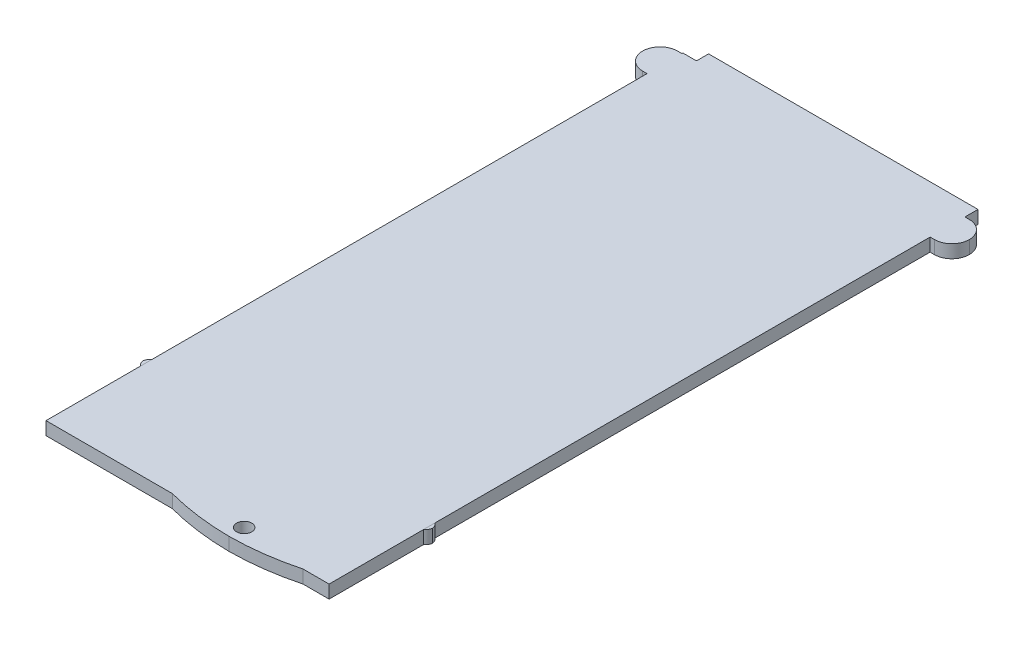
ISO-10303-21;
HEADER;
FILE_DESCRIPTION(('STEP AP214'),'2;1');
FILE_NAME('part.step','',(''),(''),'','','');
FILE_SCHEMA(('AUTOMOTIVE_DESIGN { 1 0 10303 214 1 1 1 1 }'));
ENDSEC;
DATA;
#1=APPLICATION_CONTEXT('core data for automotive mechanical design processes');
#2=APPLICATION_PROTOCOL_DEFINITION('international standard','automotive_design',2000,#1);
#3=PRODUCT_CONTEXT('',#1,'mechanical');
#4=PRODUCT('Part','Part','',(#3));
#5=PRODUCT_RELATED_PRODUCT_CATEGORY('part','',(#4));
#6=PRODUCT_DEFINITION_FORMATION('','',#4);
#7=PRODUCT_DEFINITION_CONTEXT('part definition',#1,'design');
#8=PRODUCT_DEFINITION('design','',#6,#7);
#9=PRODUCT_DEFINITION_SHAPE('','',#8);
#10=(LENGTH_UNIT() NAMED_UNIT(*) SI_UNIT(.MILLI.,.METRE.));
#11=(NAMED_UNIT(*) PLANE_ANGLE_UNIT() SI_UNIT($,.RADIAN.));
#12=(NAMED_UNIT(*) SI_UNIT($,.STERADIAN.) SOLID_ANGLE_UNIT());
#13=UNCERTAINTY_MEASURE_WITH_UNIT(LENGTH_MEASURE(1.E-05),#10,'distance_accuracy_value','');
#14=(GEOMETRIC_REPRESENTATION_CONTEXT(3) GLOBAL_UNCERTAINTY_ASSIGNED_CONTEXT((#13)) GLOBAL_UNIT_ASSIGNED_CONTEXT((#10,
#11,#12)) REPRESENTATION_CONTEXT('',''));
#15=CARTESIAN_POINT('',(0.,0.,0.));
#16=DIRECTION('',(0.,0.,1.));
#17=DIRECTION('',(1.,0.,0.));
#18=AXIS2_PLACEMENT_3D('',#15,#16,#17);
#19=CARTESIAN_POINT('',(-32.5,3.,73.));
#20=DIRECTION('',(1.,0.,0.));
#21=DIRECTION('',(0.,0.,-1.));
#22=AXIS2_PLACEMENT_3D('',#19,#20,#21);
#23=PLANE('',#22);
#24=DIRECTION('',(0.,0.,1.));
#25=VECTOR('',#24,1.);
#26=CARTESIAN_POINT('',(-32.5,0.,73.));
#27=LINE('',#26,#25);
#28=CARTESIAN_POINT('',(-32.5,0.,-62.0000000000006));
#29=VERTEX_POINT('',#28);
#30=CARTESIAN_POINT('',(-32.5,0.,51.7025621529453));
#31=VERTEX_POINT('',#30);
#32=EDGE_CURVE('E266',#29,#31,#27,.T.);
#33=ORIENTED_EDGE('',*,*,#32,.T.);
#34=DIRECTION('',(0.,1.,0.));
#35=VECTOR('',#34,1.);
#36=CARTESIAN_POINT('',(-32.5,0.,51.7025621529453));
#37=LINE('',#36,#35);
#38=CARTESIAN_POINT('',(-32.5,3.,51.7025621529453));
#39=VERTEX_POINT('',#38);
#40=EDGE_CURVE('E497',#31,#39,#37,.T.);
#41=ORIENTED_EDGE('',*,*,#40,.T.);
#42=DIRECTION('',(0.,0.,1.));
#43=VECTOR('',#42,1.);
#44=CARTESIAN_POINT('',(-32.5,3.,73.));
#45=LINE('',#44,#43);
#46=CARTESIAN_POINT('',(-32.5,3.,-62.0000000000006));
#47=VERTEX_POINT('',#46);
#48=EDGE_CURVE('E248',#47,#39,#45,.T.);
#49=ORIENTED_EDGE('',*,*,#48,.F.);
#50=DIRECTION('',(0.,-1.,0.));
#51=VECTOR('',#50,1.);
#52=CARTESIAN_POINT('',(-32.5,0.,-62.0000000000006));
#53=LINE('',#52,#51);
#54=EDGE_CURVE('E363',#47,#29,#53,.T.);
#55=ORIENTED_EDGE('',*,*,#54,.T.);
#56=EDGE_LOOP('',(#33,#41,#49,#55));
#57=FACE_BOUND('',#56,.T.);
#58=ADVANCED_FACE('F43',(#57),#23,.F.);
#59=CARTESIAN_POINT('',(32.5,3.,73.));
#60=DIRECTION('',(-1.,0.,0.));
#61=DIRECTION('',(0.,0.,1.));
#62=AXIS2_PLACEMENT_3D('',#59,#60,#61);
#63=PLANE('',#62);
#64=DIRECTION('',(0.,1.,0.));
#65=VECTOR('',#64,1.);
#66=CARTESIAN_POINT('',(32.5,0.,51.7025621529453));
#67=LINE('',#66,#65);
#68=CARTESIAN_POINT('',(32.5,0.,51.7025621529453));
#69=VERTEX_POINT('',#68);
#70=CARTESIAN_POINT('',(32.5,3.,51.7025621529453));
#71=VERTEX_POINT('',#70);
#72=EDGE_CURVE('E396',#69,#71,#67,.T.);
#73=ORIENTED_EDGE('',*,*,#72,.F.);
#74=DIRECTION('',(0.,0.,-1.));
#75=VECTOR('',#74,1.);
#76=CARTESIAN_POINT('',(32.5,0.,73.));
#77=LINE('',#76,#75);
#78=CARTESIAN_POINT('',(32.5,0.,-62.0000000000006));
#79=VERTEX_POINT('',#78);
#80=EDGE_CURVE('E260',#69,#79,#77,.T.);
#81=ORIENTED_EDGE('',*,*,#80,.T.);
#82=DIRECTION('',(0.,-1.,0.));
#83=VECTOR('',#82,1.);
#84=CARTESIAN_POINT('',(32.5,0.,-62.0000000000006));
#85=LINE('',#84,#83);
#86=CARTESIAN_POINT('',(32.5,3.,-62.0000000000006));
#87=VERTEX_POINT('',#86);
#88=EDGE_CURVE('E376',#87,#79,#85,.T.);
#89=ORIENTED_EDGE('',*,*,#88,.F.);
#90=DIRECTION('',(0.,0.,-1.));
#91=VECTOR('',#90,1.);
#92=CARTESIAN_POINT('',(32.5,3.,73.));
#93=LINE('',#92,#91);
#94=EDGE_CURVE('E252',#71,#87,#93,.T.);
#95=ORIENTED_EDGE('',*,*,#94,.F.);
#96=EDGE_LOOP('',(#73,#81,#89,#95));
#97=FACE_BOUND('',#96,.T.);
#98=ADVANCED_FACE('F394',(#97),#63,.F.);
#99=DIRECTION('',(0.,-1.,0.));
#100=VECTOR('',#99,1.);
#101=CARTESIAN_POINT('',(32.5,0.,54.3035167130892));
#102=LINE('',#101,#100);
#103=CARTESIAN_POINT('',(32.5,3.,54.3035167130892));
#104=VERTEX_POINT('',#103);
#105=CARTESIAN_POINT('',(32.5,0.,54.3035167130892));
#106=VERTEX_POINT('',#105);
#107=EDGE_CURVE('E423',#104,#106,#102,.T.);
#108=ORIENTED_EDGE('',*,*,#107,.F.);
#109=CARTESIAN_POINT('',(32.5,3.,76.));
#110=VERTEX_POINT('',#109);
#111=EDGE_CURVE('E246',#110,#104,#93,.T.);
#112=ORIENTED_EDGE('',*,*,#111,.F.);
#113=DIRECTION('',(0.,1.,0.));
#114=VECTOR('',#113,1.);
#115=CARTESIAN_POINT('',(32.5,0.,76.));
#116=LINE('',#115,#114);
#117=CARTESIAN_POINT('',(32.5,0.,76.));
#118=VERTEX_POINT('',#117);
#119=EDGE_CURVE('E330',#118,#110,#116,.T.);
#120=ORIENTED_EDGE('',*,*,#119,.F.);
#121=EDGE_CURVE('E257',#118,#106,#77,.T.);
#122=ORIENTED_EDGE('',*,*,#121,.T.);
#123=EDGE_LOOP('',(#108,#112,#120,#122));
#124=FACE_BOUND('',#123,.T.);
#125=ADVANCED_FACE('F431',(#124),#63,.F.);
#126=CARTESIAN_POINT('',(-32.5,3.,-70.2180534744469));
#127=VERTEX_POINT('',#126);
#128=CARTESIAN_POINT('',(-32.5,3.,-70.0000000000006));
#129=VERTEX_POINT('',#128);
#130=EDGE_CURVE('E250',#127,#129,#45,.T.);
#131=ORIENTED_EDGE('',*,*,#130,.F.);
#132=DIRECTION('',(0.,1.,0.));
#133=VECTOR('',#132,1.);
#134=CARTESIAN_POINT('',(-32.5,-7.,-70.2180534744469));
#135=LINE('',#134,#133);
#136=CARTESIAN_POINT('',(-32.5,0.,-70.2180534744469));
#137=VERTEX_POINT('',#136);
#138=EDGE_CURVE('E240',#137,#127,#135,.T.);
#139=ORIENTED_EDGE('',*,*,#138,.F.);
#140=CARTESIAN_POINT('',(-32.5,0.,-70.0000000000006));
#141=VERTEX_POINT('',#140);
#142=EDGE_CURVE('E264',#137,#141,#27,.T.);
#143=ORIENTED_EDGE('',*,*,#142,.T.);
#144=DIRECTION('',(0.,1.,0.));
#145=VECTOR('',#144,1.);
#146=CARTESIAN_POINT('',(-32.5,0.,-70.0000000000006));
#147=LINE('',#146,#145);
#148=EDGE_CURVE('E303',#141,#129,#147,.T.);
#149=ORIENTED_EDGE('',*,*,#148,.T.);
#150=EDGE_LOOP('',(#131,#139,#143,#149));
#151=FACE_BOUND('',#150,.T.);
#152=ADVANCED_FACE('F347',(#151),#23,.F.);
#153=DIRECTION('',(0.,1.,0.));
#154=VECTOR('',#153,1.);
#155=CARTESIAN_POINT('',(32.5,0.,-70.0000000000006));
#156=LINE('',#155,#154);
#157=CARTESIAN_POINT('',(32.5,0.,-70.0000000000006));
#158=VERTEX_POINT('',#157);
#159=CARTESIAN_POINT('',(32.5,3.,-70.0000000000006));
#160=VERTEX_POINT('',#159);
#161=EDGE_CURVE('E285',#158,#160,#156,.T.);
#162=ORIENTED_EDGE('',*,*,#161,.F.);
#163=CARTESIAN_POINT('',(32.5,0.,-73.));
#164=VERTEX_POINT('',#163);
#165=EDGE_CURVE('E261',#158,#164,#77,.T.);
#166=ORIENTED_EDGE('',*,*,#165,.T.);
#167=DIRECTION('',(0.,-1.,0.));
#168=VECTOR('',#167,1.);
#169=CARTESIAN_POINT('',(32.5,3.,-73.));
#170=LINE('',#169,#168);
#171=CARTESIAN_POINT('',(32.5,3.,-73.));
#172=VERTEX_POINT('',#171);
#173=EDGE_CURVE('E256',#172,#164,#170,.T.);
#174=ORIENTED_EDGE('',*,*,#173,.F.);
#175=EDGE_CURVE('E244',#160,#172,#93,.T.);
#176=ORIENTED_EDGE('',*,*,#175,.F.);
#177=EDGE_LOOP('',(#162,#166,#174,#176));
#178=FACE_BOUND('',#177,.T.);
#179=ADVANCED_FACE('F457',(#178),#63,.F.);
#180=CARTESIAN_POINT('',(-32.5,3.,-73.));
#181=DIRECTION('',(0.,0.,1.));
#182=DIRECTION('',(1.,0.,0.));
#183=AXIS2_PLACEMENT_3D('',#180,#181,#182);
#184=PLANE('',#183);
#185=DIRECTION('',(-1.,0.,0.));
#186=VECTOR('',#185,1.);
#187=CARTESIAN_POINT('',(-32.5,0.,-73.));
#188=LINE('',#187,#186);
#189=CARTESIAN_POINT('',(-29.3603562489109,0.,-73.));
#190=VERTEX_POINT('',#189);
#191=EDGE_CURVE('E239',#164,#190,#188,.T.);
#192=ORIENTED_EDGE('',*,*,#191,.T.);
#193=DIRECTION('',(0.,1.,0.));
#194=VECTOR('',#193,1.);
#195=CARTESIAN_POINT('',(-29.3603562489109,-7.,-73.));
#196=LINE('',#195,#194);
#197=CARTESIAN_POINT('',(-29.3603562489109,3.,-73.));
#198=VERTEX_POINT('',#197);
#199=EDGE_CURVE('E224',#190,#198,#196,.T.);
#200=ORIENTED_EDGE('',*,*,#199,.T.);
#201=DIRECTION('',(-1.,0.,0.));
#202=VECTOR('',#201,1.);
#203=CARTESIAN_POINT('',(-32.5,3.,-73.));
#204=LINE('',#203,#202);
#205=EDGE_CURVE('E236',#172,#198,#204,.T.);
#206=ORIENTED_EDGE('',*,*,#205,.F.);
#207=ORIENTED_EDGE('',*,*,#173,.T.);
#208=EDGE_LOOP('',(#192,#200,#206,#207));
#209=FACE_BOUND('',#208,.T.);
#210=ADVANCED_FACE('F234',(#209),#184,.F.);
#211=CARTESIAN_POINT('',(-32.5,3.,54.3035167130892));
#212=VERTEX_POINT('',#211);
#213=CARTESIAN_POINT('',(-32.5,3.,76.));
#214=VERTEX_POINT('',#213);
#215=EDGE_CURVE('E245',#212,#214,#45,.T.);
#216=ORIENTED_EDGE('',*,*,#215,.F.);
#217=DIRECTION('',(0.,-1.,0.));
#218=VECTOR('',#217,1.);
#219=CARTESIAN_POINT('',(-32.5,0.,54.3035167130892));
#220=LINE('',#219,#218);
#221=CARTESIAN_POINT('',(-32.5,0.,54.3035167130892));
#222=VERTEX_POINT('',#221);
#223=EDGE_CURVE('E475',#212,#222,#220,.T.);
#224=ORIENTED_EDGE('',*,*,#223,.T.);
#225=CARTESIAN_POINT('',(-32.5,0.,76.));
#226=VERTEX_POINT('',#225);
#227=EDGE_CURVE('E263',#222,#226,#27,.T.);
#228=ORIENTED_EDGE('',*,*,#227,.T.);
#229=DIRECTION('',(0.,1.,0.));
#230=VECTOR('',#229,1.);
#231=CARTESIAN_POINT('',(-32.5,0.,76.));
#232=LINE('',#231,#230);
#233=EDGE_CURVE('E478',#226,#214,#232,.T.);
#234=ORIENTED_EDGE('',*,*,#233,.T.);
#235=EDGE_LOOP('',(#216,#224,#228,#234));
#236=FACE_BOUND('',#235,.T.);
#237=ADVANCED_FACE('F452',(#236),#23,.F.);
#238=CARTESIAN_POINT('',(0.,3.,0.));
#239=DIRECTION('',(0.,-1.,0.));
#240=DIRECTION('',(0.,0.,-1.));
#241=AXIS2_PLACEMENT_3D('',#238,#239,#240);
#242=PLANE('',#241);
#243=CARTESIAN_POINT('',(11.5,3.,74.5));
#244=DIRECTION('',(0.,1.,0.));
#245=DIRECTION('',(0.,0.,1.));
#246=AXIS2_PLACEMENT_3D('',#243,#244,#245);
#247=CIRCLE('',#246,1.75);
#248=CARTESIAN_POINT('',(11.5,3.,76.25));
#249=VERTEX_POINT('',#248);
#250=EDGE_CURVE('E515',#249,#249,#247,.T.);
#251=ORIENTED_EDGE('',*,*,#250,.F.);
#252=EDGE_LOOP('',(#251));
#253=FACE_BOUND('',#252,.T.);
#254=ORIENTED_EDGE('',*,*,#205,.T.);
#255=DIRECTION('',(0.,0.,-1.));
#256=VECTOR('',#255,1.);
#257=CARTESIAN_POINT('',(-29.3603562489109,3.,-73.));
#258=LINE('',#257,#256);
#259=CARTESIAN_POINT('',(-29.3603562489109,3.,-70.2180534744469));
#260=VERTEX_POINT('',#259);
#261=EDGE_CURVE('E221',#260,#198,#258,.T.);
#262=ORIENTED_EDGE('',*,*,#261,.F.);
#263=DIRECTION('',(1.,0.,0.));
#264=VECTOR('',#263,1.);
#265=CARTESIAN_POINT('',(-29.3603562489109,3.,-70.2180534744469));
#266=LINE('',#265,#264);
#267=EDGE_CURVE('E229',#127,#260,#266,.T.);
#268=ORIENTED_EDGE('',*,*,#267,.F.);
#269=ORIENTED_EDGE('',*,*,#130,.T.);
#270=DIRECTION('',(1.,0.,0.));
#271=VECTOR('',#270,1.);
#272=CARTESIAN_POINT('',(-37.5,3.,-70.0000000000006));
#273=LINE('',#272,#271);
#274=CARTESIAN_POINT('',(-33.5,3.,-70.0000000000006));
#275=VERTEX_POINT('',#274);
#276=EDGE_CURVE('E362',#275,#129,#273,.T.);
#277=ORIENTED_EDGE('',*,*,#276,.F.);
#278=CARTESIAN_POINT('',(-33.5,3.,-66.0000000000006));
#279=DIRECTION('',(0.,-1.,0.));
#280=DIRECTION('',(0.,0.,-1.));
#281=AXIS2_PLACEMENT_3D('',#278,#279,#280);
#282=CIRCLE('',#281,4.);
#283=CARTESIAN_POINT('',(-37.5,3.,-66.0000000000006));
#284=VERTEX_POINT('',#283);
#285=EDGE_CURVE('E293',#275,#284,#282,.F.);
#286=ORIENTED_EDGE('',*,*,#285,.T.);
#287=CARTESIAN_POINT('',(-33.5,3.,-66.0000000000006));
#288=DIRECTION('',(0.,-1.,0.));
#289=DIRECTION('',(0.,0.,-1.));
#290=AXIS2_PLACEMENT_3D('',#287,#288,#289);
#291=CIRCLE('',#290,4.);
#292=CARTESIAN_POINT('',(-33.5,3.,-62.0000000000006));
#293=VERTEX_POINT('',#292);
#294=EDGE_CURVE('E295',#284,#293,#291,.F.);
#295=ORIENTED_EDGE('',*,*,#294,.T.);
#296=DIRECTION('',(1.,0.,0.));
#297=VECTOR('',#296,1.);
#298=CARTESIAN_POINT('',(-37.5,3.,-62.0000000000006));
#299=LINE('',#298,#297);
#300=EDGE_CURVE('E371',#293,#47,#299,.T.);
#301=ORIENTED_EDGE('',*,*,#300,.T.);
#302=ORIENTED_EDGE('',*,*,#48,.T.);
#303=DIRECTION('',(0.,0.,-1.));
#304=VECTOR('',#303,1.);
#305=CARTESIAN_POINT('',(-32.5,3.,0.));
#306=LINE('',#305,#304);
#307=EDGE_CURVE('E317',#212,#39,#306,.T.);
#308=ORIENTED_EDGE('',*,*,#307,.F.);
#309=ORIENTED_EDGE('',*,*,#215,.T.);
#310=DIRECTION('',(1.,0.,0.));
#311=VECTOR('',#310,1.);
#312=CARTESIAN_POINT('',(0.,3.,76.));
#313=LINE('',#312,#311);
#314=CARTESIAN_POINT('',(-3.5,3.,76.));
#315=VERTEX_POINT('',#314);
#316=EDGE_CURVE('E340',#214,#315,#313,.T.);
#317=ORIENTED_EDGE('',*,*,#316,.T.);
#318=CARTESIAN_POINT('',(11.8622914957372,3.,18.));
#319=DIRECTION('',(0.,-1.,0.));
#320=DIRECTION('',(0.,0.,-1.));
#321=AXIS2_PLACEMENT_3D('',#318,#319,#320);
#322=CIRCLE('',#321,60.);
#323=CARTESIAN_POINT('',(11.5,3.,77.9989061972976));
#324=VERTEX_POINT('',#323);
#325=EDGE_CURVE('E325',#315,#324,#322,.F.);
#326=ORIENTED_EDGE('',*,*,#325,.T.);
#327=CARTESIAN_POINT('',(11.1377085042628,3.,18.));
#328=DIRECTION('',(0.,-1.,0.));
#329=DIRECTION('',(0.,0.,-1.));
#330=AXIS2_PLACEMENT_3D('',#327,#328,#329);
#331=CIRCLE('',#330,60.);
#332=CARTESIAN_POINT('',(26.5,3.,76.));
#333=VERTEX_POINT('',#332);
#334=EDGE_CURVE('E332',#324,#333,#331,.F.);
#335=ORIENTED_EDGE('',*,*,#334,.T.);
#336=EDGE_CURVE('E509',#333,#110,#313,.T.);
#337=ORIENTED_EDGE('',*,*,#336,.T.);
#338=ORIENTED_EDGE('',*,*,#111,.T.);
#339=DIRECTION('',(0.,0.,1.));
#340=VECTOR('',#339,1.);
#341=CARTESIAN_POINT('',(32.5,3.,0.));
#342=LINE('',#341,#340);
#343=EDGE_CURVE('E304',#71,#104,#342,.T.);
#344=ORIENTED_EDGE('',*,*,#343,.F.);
#345=ORIENTED_EDGE('',*,*,#94,.T.);
#346=DIRECTION('',(-1.,0.,0.));
#347=VECTOR('',#346,1.);
#348=CARTESIAN_POINT('',(37.5,3.,-62.0000000000006));
#349=LINE('',#348,#347);
#350=CARTESIAN_POINT('',(33.5,3.,-62.0000000000006));
#351=VERTEX_POINT('',#350);
#352=EDGE_CURVE('E384',#351,#87,#349,.T.);
#353=ORIENTED_EDGE('',*,*,#352,.F.);
#354=CARTESIAN_POINT('',(33.5,3.,-66.0000000000006));
#355=DIRECTION('',(0.,-1.,0.));
#356=DIRECTION('',(0.,0.,-1.));
#357=AXIS2_PLACEMENT_3D('',#354,#355,#356);
#358=CIRCLE('',#357,4.);
#359=CARTESIAN_POINT('',(37.5,3.,-66.0000000000006));
#360=VERTEX_POINT('',#359);
#361=EDGE_CURVE('E277',#351,#360,#358,.F.);
#362=ORIENTED_EDGE('',*,*,#361,.T.);
#363=CARTESIAN_POINT('',(33.5,3.,-66.0000000000006));
#364=DIRECTION('',(0.,-1.,0.));
#365=DIRECTION('',(0.,0.,-1.));
#366=AXIS2_PLACEMENT_3D('',#363,#364,#365);
#367=CIRCLE('',#366,4.);
#368=CARTESIAN_POINT('',(33.5,3.,-70.0000000000006));
#369=VERTEX_POINT('',#368);
#370=EDGE_CURVE('E275',#360,#369,#367,.F.);
#371=ORIENTED_EDGE('',*,*,#370,.T.);
#372=DIRECTION('',(-1.,0.,0.));
#373=VECTOR('',#372,1.);
#374=CARTESIAN_POINT('',(37.5,3.,-70.0000000000006));
#375=LINE('',#374,#373);
#376=EDGE_CURVE('E386',#369,#160,#375,.T.);
#377=ORIENTED_EDGE('',*,*,#376,.T.);
#378=ORIENTED_EDGE('',*,*,#175,.T.);
#379=EDGE_LOOP('',(#254,#262,#268,#269,#277,#286,#295,#301,#302,#308,#309,#317,#326,#335,#337,
#338,#344,#345,#353,#362,#371,#377,#378));
#380=FACE_BOUND('',#379,.T.);
#381=ADVANCED_FACE('F242',(#253,#380),#242,.F.);
#382=CARTESIAN_POINT('',(0.,0.,0.));
#383=DIRECTION('',(0.,-1.,0.));
#384=DIRECTION('',(0.,0.,-1.));
#385=AXIS2_PLACEMENT_3D('',#382,#383,#384);
#386=PLANE('',#385);
#387=CARTESIAN_POINT('',(11.5,0.,74.5));
#388=DIRECTION('',(0.,-1.,0.));
#389=DIRECTION('',(0.,0.,-1.));
#390=AXIS2_PLACEMENT_3D('',#387,#388,#389);
#391=CIRCLE('',#390,1.75);
#392=CARTESIAN_POINT('',(11.5,0.,72.75));
#393=VERTEX_POINT('',#392);
#394=EDGE_CURVE('E47',#393,#393,#391,.T.);
#395=ORIENTED_EDGE('',*,*,#394,.F.);
#396=EDGE_LOOP('',(#395));
#397=FACE_BOUND('',#396,.T.);
#398=DIRECTION('',(0.,0.,1.));
#399=VECTOR('',#398,1.);
#400=CARTESIAN_POINT('',(-29.3603562489109,0.,0.));
#401=LINE('',#400,#399);
#402=CARTESIAN_POINT('',(-29.3603562489109,0.,-70.2180534744469));
#403=VERTEX_POINT('',#402);
#404=EDGE_CURVE('E11',#190,#403,#401,.T.);
#405=ORIENTED_EDGE('',*,*,#404,.F.);
#406=ORIENTED_EDGE('',*,*,#191,.F.);
#407=ORIENTED_EDGE('',*,*,#165,.F.);
#408=DIRECTION('',(-1.,0.,0.));
#409=VECTOR('',#408,1.);
#410=CARTESIAN_POINT('',(37.5,0.,-70.0000000000006));
#411=LINE('',#410,#409);
#412=CARTESIAN_POINT('',(33.5,0.,-70.0000000000006));
#413=VERTEX_POINT('',#412);
#414=EDGE_CURVE('E379',#413,#158,#411,.T.);
#415=ORIENTED_EDGE('',*,*,#414,.F.);
#416=CARTESIAN_POINT('',(33.5,0.,-66.0000000000006));
#417=DIRECTION('',(0.,-1.,0.));
#418=DIRECTION('',(0.,0.,-1.));
#419=AXIS2_PLACEMENT_3D('',#416,#417,#418);
#420=CIRCLE('',#419,4.);
#421=CARTESIAN_POINT('',(37.5,0.,-66.0000000000006));
#422=VERTEX_POINT('',#421);
#423=EDGE_CURVE('E268',#413,#422,#420,.T.);
#424=ORIENTED_EDGE('',*,*,#423,.T.);
#425=CARTESIAN_POINT('',(33.5,0.,-66.0000000000006));
#426=DIRECTION('',(0.,-1.,0.));
#427=DIRECTION('',(0.,0.,-1.));
#428=AXIS2_PLACEMENT_3D('',#425,#426,#427);
#429=CIRCLE('',#428,4.);
#430=CARTESIAN_POINT('',(33.5,0.,-62.0000000000006));
#431=VERTEX_POINT('',#430);
#432=EDGE_CURVE('E270',#422,#431,#429,.T.);
#433=ORIENTED_EDGE('',*,*,#432,.T.);
#434=DIRECTION('',(-1.,0.,0.));
#435=VECTOR('',#434,1.);
#436=CARTESIAN_POINT('',(37.5,0.,-62.0000000000006));
#437=LINE('',#436,#435);
#438=EDGE_CURVE('E381',#431,#79,#437,.T.);
#439=ORIENTED_EDGE('',*,*,#438,.T.);
#440=ORIENTED_EDGE('',*,*,#80,.F.);
#441=CARTESIAN_POINT('',(31.3,0.,53.3025621529453));
#442=DIRECTION('',(0.,-1.,0.));
#443=DIRECTION('',(0.,0.,-1.));
#444=AXIS2_PLACEMENT_3D('',#441,#442,#443);
#445=CIRCLE('',#444,2.);
#446=CARTESIAN_POINT('',(33.2774443456762,0.,53.0030394330172));
#447=VERTEX_POINT('',#446);
#448=EDGE_CURVE('E310',#69,#447,#445,.T.);
#449=ORIENTED_EDGE('',*,*,#448,.T.);
#450=CARTESIAN_POINT('',(31.3,0.,52.7035167130892));
#451=DIRECTION('',(0.,-1.,0.));
#452=DIRECTION('',(0.,0.,-1.));
#453=AXIS2_PLACEMENT_3D('',#450,#451,#452);
#454=CIRCLE('',#453,2.);
#455=EDGE_CURVE('E308',#447,#106,#454,.T.);
#456=ORIENTED_EDGE('',*,*,#455,.T.);
#457=ORIENTED_EDGE('',*,*,#121,.F.);
#458=DIRECTION('',(1.,0.,0.));
#459=VECTOR('',#458,1.);
#460=CARTESIAN_POINT('',(0.,0.,76.));
#461=LINE('',#460,#459);
#462=CARTESIAN_POINT('',(26.5,0.,76.));
#463=VERTEX_POINT('',#462);
#464=EDGE_CURVE('E435',#463,#118,#461,.T.);
#465=ORIENTED_EDGE('',*,*,#464,.F.);
#466=CARTESIAN_POINT('',(11.1377085042628,0.,18.));
#467=DIRECTION('',(0.,-1.,0.));
#468=DIRECTION('',(0.,0.,-1.));
#469=AXIS2_PLACEMENT_3D('',#466,#467,#468);
#470=CIRCLE('',#469,60.);
#471=CARTESIAN_POINT('',(11.5,0.,77.9989061972976));
#472=VERTEX_POINT('',#471);
#473=EDGE_CURVE('E66',#463,#472,#470,.T.);
#474=ORIENTED_EDGE('',*,*,#473,.T.);
#475=CARTESIAN_POINT('',(11.8622914957372,0.,18.));
#476=DIRECTION('',(0.,-1.,0.));
#477=DIRECTION('',(0.,0.,-1.));
#478=AXIS2_PLACEMENT_3D('',#475,#476,#477);
#479=CIRCLE('',#478,60.);
#480=CARTESIAN_POINT('',(-3.5,0.,76.));
#481=VERTEX_POINT('',#480);
#482=EDGE_CURVE('E334',#472,#481,#479,.T.);
#483=ORIENTED_EDGE('',*,*,#482,.T.);
#484=EDGE_CURVE('E510',#226,#481,#461,.T.);
#485=ORIENTED_EDGE('',*,*,#484,.F.);
#486=ORIENTED_EDGE('',*,*,#227,.F.);
#487=CARTESIAN_POINT('',(-31.3,0.,52.7035167130892));
#488=DIRECTION('',(0.,-1.,0.));
#489=DIRECTION('',(0.,0.,-1.));
#490=AXIS2_PLACEMENT_3D('',#487,#488,#489);
#491=CIRCLE('',#490,2.);
#492=CARTESIAN_POINT('',(-33.2774443456762,0.,53.0030394330172));
#493=VERTEX_POINT('',#492);
#494=EDGE_CURVE('E321',#222,#493,#491,.T.);
#495=ORIENTED_EDGE('',*,*,#494,.T.);
#496=CARTESIAN_POINT('',(-31.3,0.,53.3025621529453));
#497=DIRECTION('',(0.,-1.,0.));
#498=DIRECTION('',(0.,0.,-1.));
#499=AXIS2_PLACEMENT_3D('',#496,#497,#498);
#500=CIRCLE('',#499,2.);
#501=EDGE_CURVE('E323',#493,#31,#500,.T.);
#502=ORIENTED_EDGE('',*,*,#501,.T.);
#503=ORIENTED_EDGE('',*,*,#32,.F.);
#504=DIRECTION('',(1.,0.,0.));
#505=VECTOR('',#504,1.);
#506=CARTESIAN_POINT('',(-37.5,0.,-62.0000000000006));
#507=LINE('',#506,#505);
#508=CARTESIAN_POINT('',(-33.5,0.,-62.0000000000006));
#509=VERTEX_POINT('',#508);
#510=EDGE_CURVE('E357',#509,#29,#507,.T.);
#511=ORIENTED_EDGE('',*,*,#510,.F.);
#512=CARTESIAN_POINT('',(-33.5,0.,-66.0000000000006));
#513=DIRECTION('',(0.,-1.,0.));
#514=DIRECTION('',(0.,0.,-1.));
#515=AXIS2_PLACEMENT_3D('',#512,#513,#514);
#516=CIRCLE('',#515,4.);
#517=CARTESIAN_POINT('',(-37.5,0.,-66.0000000000006));
#518=VERTEX_POINT('',#517);
#519=EDGE_CURVE('E291',#509,#518,#516,.T.);
#520=ORIENTED_EDGE('',*,*,#519,.T.);
#521=CARTESIAN_POINT('',(-33.5,0.,-66.0000000000006));
#522=DIRECTION('',(0.,-1.,0.));
#523=DIRECTION('',(0.,0.,-1.));
#524=AXIS2_PLACEMENT_3D('',#521,#522,#523);
#525=CIRCLE('',#524,4.);
#526=CARTESIAN_POINT('',(-33.5,0.,-70.0000000000006));
#527=VERTEX_POINT('',#526);
#528=EDGE_CURVE('E289',#518,#527,#525,.T.);
#529=ORIENTED_EDGE('',*,*,#528,.T.);
#530=DIRECTION('',(1.,0.,0.));
#531=VECTOR('',#530,1.);
#532=CARTESIAN_POINT('',(-37.5,0.,-70.0000000000006));
#533=LINE('',#532,#531);
#534=EDGE_CURVE('E286',#527,#141,#533,.T.);
#535=ORIENTED_EDGE('',*,*,#534,.T.);
#536=ORIENTED_EDGE('',*,*,#142,.F.);
#537=DIRECTION('',(-1.,0.,0.));
#538=VECTOR('',#537,1.);
#539=CARTESIAN_POINT('',(0.,0.,-70.2180534744469));
#540=LINE('',#539,#538);
#541=EDGE_CURVE('E52',#403,#137,#540,.T.);
#542=ORIENTED_EDGE('',*,*,#541,.F.);
#543=EDGE_LOOP('',(#405,#406,#407,#415,#424,#433,#439,#440,#449,#456,#457,#465,#474,#483,#485,
#486,#495,#502,#503,#511,#520,#529,#535,#536,#542));
#544=FACE_BOUND('',#543,.T.);
#545=ADVANCED_FACE('F351',(#397,#544),#386,.T.);
#546=CARTESIAN_POINT('',(37.5,0.,-70.0000000000006));
#547=DIRECTION('',(0.,0.,1.));
#548=DIRECTION('',(1.,0.,0.));
#549=AXIS2_PLACEMENT_3D('',#546,#547,#548);
#550=PLANE('',#549);
#551=ORIENTED_EDGE('',*,*,#376,.F.);
#552=DIRECTION('',(0.,1.,0.));
#553=VECTOR('',#552,1.);
#554=CARTESIAN_POINT('',(33.5,0.,-70.0000000000006));
#555=LINE('',#554,#553);
#556=EDGE_CURVE('E279',#369,#413,#555,.F.);
#557=ORIENTED_EDGE('',*,*,#556,.T.);
#558=ORIENTED_EDGE('',*,*,#414,.T.);
#559=ORIENTED_EDGE('',*,*,#161,.T.);
#560=EDGE_LOOP('',(#551,#557,#558,#559));
#561=FACE_BOUND('',#560,.T.);
#562=ADVANCED_FACE('F525',(#561),#550,.F.);
#563=CARTESIAN_POINT('',(37.5,0.,-62.0000000000006));
#564=DIRECTION('',(0.,0.,-1.));
#565=DIRECTION('',(-1.,0.,0.));
#566=AXIS2_PLACEMENT_3D('',#563,#564,#565);
#567=PLANE('',#566);
#568=ORIENTED_EDGE('',*,*,#438,.F.);
#569=DIRECTION('',(0.,-1.,0.));
#570=VECTOR('',#569,1.);
#571=CARTESIAN_POINT('',(33.5,3.,-62.0000000000006));
#572=LINE('',#571,#570);
#573=EDGE_CURVE('E272',#431,#351,#572,.F.);
#574=ORIENTED_EDGE('',*,*,#573,.T.);
#575=ORIENTED_EDGE('',*,*,#352,.T.);
#576=ORIENTED_EDGE('',*,*,#88,.T.);
#577=EDGE_LOOP('',(#568,#574,#575,#576));
#578=FACE_BOUND('',#577,.T.);
#579=ADVANCED_FACE('F402',(#578),#567,.F.);
#580=CARTESIAN_POINT('',(33.5,0.,-66.0000000000006));
#581=DIRECTION('',(0.,-1.,0.));
#582=DIRECTION('',(0.,0.,-1.));
#583=AXIS2_PLACEMENT_3D('',#580,#581,#582);
#584=CYLINDRICAL_SURFACE('',#583,4.);
#585=ORIENTED_EDGE('',*,*,#556,.F.);
#586=ORIENTED_EDGE('',*,*,#370,.F.);
#587=DIRECTION('',(0.,1.,0.));
#588=VECTOR('',#587,1.);
#589=CARTESIAN_POINT('',(37.5,3.,-66.0000000000006));
#590=LINE('',#589,#588);
#591=EDGE_CURVE('E282',#422,#360,#590,.T.);
#592=ORIENTED_EDGE('',*,*,#591,.F.);
#593=ORIENTED_EDGE('',*,*,#423,.F.);
#594=EDGE_LOOP('',(#585,#586,#592,#593));
#595=FACE_BOUND('',#594,.T.);
#596=ADVANCED_FACE('F535',(#595),#584,.T.);
#597=CARTESIAN_POINT('',(33.5,0.,-66.0000000000006));
#598=DIRECTION('',(0.,1.,0.));
#599=DIRECTION('',(0.,0.,1.));
#600=AXIS2_PLACEMENT_3D('',#597,#598,#599);
#601=CYLINDRICAL_SURFACE('',#600,4.);
#602=ORIENTED_EDGE('',*,*,#361,.F.);
#603=ORIENTED_EDGE('',*,*,#573,.F.);
#604=ORIENTED_EDGE('',*,*,#432,.F.);
#605=ORIENTED_EDGE('',*,*,#591,.T.);
#606=EDGE_LOOP('',(#602,#603,#604,#605));
#607=FACE_BOUND('',#606,.T.);
#608=ADVANCED_FACE('F538',(#607),#601,.T.);
#609=CARTESIAN_POINT('',(-37.5,0.,-70.0000000000006));
#610=DIRECTION('',(0.,0.,-1.));
#611=DIRECTION('',(-1.,0.,0.));
#612=AXIS2_PLACEMENT_3D('',#609,#610,#611);
#613=PLANE('',#612);
#614=ORIENTED_EDGE('',*,*,#534,.F.);
#615=DIRECTION('',(0.,1.,0.));
#616=VECTOR('',#615,1.);
#617=CARTESIAN_POINT('',(-33.5,0.,-70.0000000000006));
#618=LINE('',#617,#616);
#619=EDGE_CURVE('E297',#527,#275,#618,.T.);
#620=ORIENTED_EDGE('',*,*,#619,.T.);
#621=ORIENTED_EDGE('',*,*,#276,.T.);
#622=ORIENTED_EDGE('',*,*,#148,.F.);
#623=EDGE_LOOP('',(#614,#620,#621,#622));
#624=FACE_BOUND('',#623,.T.);
#625=ADVANCED_FACE('F360',(#624),#613,.T.);
#626=CARTESIAN_POINT('',(-37.5,0.,-62.0000000000006));
#627=DIRECTION('',(0.,0.,1.));
#628=DIRECTION('',(1.,0.,0.));
#629=AXIS2_PLACEMENT_3D('',#626,#627,#628);
#630=PLANE('',#629);
#631=ORIENTED_EDGE('',*,*,#300,.F.);
#632=DIRECTION('',(0.,-1.,0.));
#633=VECTOR('',#632,1.);
#634=CARTESIAN_POINT('',(-33.5,0.,-62.0000000000006));
#635=LINE('',#634,#633);
#636=EDGE_CURVE('E281',#293,#509,#635,.T.);
#637=ORIENTED_EDGE('',*,*,#636,.T.);
#638=ORIENTED_EDGE('',*,*,#510,.T.);
#639=ORIENTED_EDGE('',*,*,#54,.F.);
#640=EDGE_LOOP('',(#631,#637,#638,#639));
#641=FACE_BOUND('',#640,.T.);
#642=ADVANCED_FACE('F537',(#641),#630,.T.);
#643=CARTESIAN_POINT('',(-33.5,0.,-66.0000000000006));
#644=DIRECTION('',(0.,1.,0.));
#645=DIRECTION('',(0.,0.,1.));
#646=AXIS2_PLACEMENT_3D('',#643,#644,#645);
#647=CYLINDRICAL_SURFACE('',#646,4.);
#648=DIRECTION('',(0.,1.,0.));
#649=VECTOR('',#648,1.);
#650=CARTESIAN_POINT('',(-37.5,0.,-66.0000000000006));
#651=LINE('',#650,#649);
#652=EDGE_CURVE('E300',#284,#518,#651,.F.);
#653=ORIENTED_EDGE('',*,*,#652,.F.);
#654=ORIENTED_EDGE('',*,*,#285,.F.);
#655=ORIENTED_EDGE('',*,*,#619,.F.);
#656=ORIENTED_EDGE('',*,*,#528,.F.);
#657=EDGE_LOOP('',(#653,#654,#655,#656));
#658=FACE_BOUND('',#657,.T.);
#659=ADVANCED_FACE('F540',(#658),#647,.T.);
#660=CARTESIAN_POINT('',(-33.5,0.,-66.0000000000006));
#661=DIRECTION('',(0.,-1.,0.));
#662=DIRECTION('',(0.,0.,-1.));
#663=AXIS2_PLACEMENT_3D('',#660,#661,#662);
#664=CYLINDRICAL_SURFACE('',#663,4.);
#665=ORIENTED_EDGE('',*,*,#294,.F.);
#666=ORIENTED_EDGE('',*,*,#652,.T.);
#667=ORIENTED_EDGE('',*,*,#519,.F.);
#668=ORIENTED_EDGE('',*,*,#636,.F.);
#669=EDGE_LOOP('',(#665,#666,#667,#668));
#670=FACE_BOUND('',#669,.T.);
#671=ADVANCED_FACE('F446',(#670),#664,.T.);
#672=CARTESIAN_POINT('',(32.5,0.,0.));
#673=DIRECTION('',(1.,0.,0.));
#674=DIRECTION('',(0.,0.,-1.));
#675=AXIS2_PLACEMENT_3D('',#672,#673,#674);
#676=PLANE('',#675);
#677=CARTESIAN_POINT('',(32.5,3.0011014155507,51.7025621529453));
#678=VERTEX_POINT('',#677);
#679=EDGE_CURVE('E316',#71,#678,#67,.T.);
#680=ORIENTED_EDGE('',*,*,#679,.F.);
#681=ORIENTED_EDGE('',*,*,#343,.T.);
#682=CARTESIAN_POINT('',(32.5,3.0011014155507,54.3035167130892));
#683=VERTEX_POINT('',#682);
#684=EDGE_CURVE('E412',#683,#104,#102,.T.);
#685=ORIENTED_EDGE('',*,*,#684,.F.);
#686=DIRECTION('',(0.,0.,1.));
#687=VECTOR('',#686,1.);
#688=CARTESIAN_POINT('',(32.5,3.0011014155507,51.7025621529453));
#689=LINE('',#688,#687);
#690=EDGE_CURVE('E416',#678,#683,#689,.T.);
#691=ORIENTED_EDGE('',*,*,#690,.F.);
#692=EDGE_LOOP('',(#680,#681,#685,#691));
#693=FACE_BOUND('',#692,.T.);
#694=ADVANCED_FACE('F415',(#693),#676,.F.);
#695=CARTESIAN_POINT('',(33.3,3.0011014155507,51.7025621529453));
#696=DIRECTION('',(0.,-1.,0.));
#697=DIRECTION('',(0.,0.,-1.));
#698=AXIS2_PLACEMENT_3D('',#695,#696,#697);
#699=PLANE('',#698);
#700=CARTESIAN_POINT('',(31.3,3.0011014155507,52.7035167130892));
#701=DIRECTION('',(0.,-1.,0.));
#702=DIRECTION('',(0.,0.,-1.));
#703=AXIS2_PLACEMENT_3D('',#700,#701,#702);
#704=CIRCLE('',#703,2.);
#705=CARTESIAN_POINT('',(33.2774443456762,3.0011014155507,53.0030394330172));
#706=VERTEX_POINT('',#705);
#707=EDGE_CURVE('E299',#683,#706,#704,.F.);
#708=ORIENTED_EDGE('',*,*,#707,.T.);
#709=CARTESIAN_POINT('',(31.3,3.0011014155507,53.3025621529453));
#710=DIRECTION('',(0.,-1.,0.));
#711=DIRECTION('',(0.,0.,-1.));
#712=AXIS2_PLACEMENT_3D('',#709,#710,#711);
#713=CIRCLE('',#712,2.);
#714=EDGE_CURVE('E306',#706,#678,#713,.F.);
#715=ORIENTED_EDGE('',*,*,#714,.T.);
#716=ORIENTED_EDGE('',*,*,#690,.T.);
#717=EDGE_LOOP('',(#708,#715,#716));
#718=FACE_BOUND('',#717,.T.);
#719=ADVANCED_FACE('F438',(#718),#699,.F.);
#720=CARTESIAN_POINT('',(31.3,0.,52.7035167130892));
#721=DIRECTION('',(0.,1.,0.));
#722=DIRECTION('',(0.,0.,1.));
#723=AXIS2_PLACEMENT_3D('',#720,#721,#722);
#724=CYLINDRICAL_SURFACE('',#723,2.);
#725=ORIENTED_EDGE('',*,*,#107,.T.);
#726=ORIENTED_EDGE('',*,*,#455,.F.);
#727=DIRECTION('',(0.,1.,0.));
#728=VECTOR('',#727,1.);
#729=CARTESIAN_POINT('',(33.2774443456762,1.50055070777535,53.0030394330172));
#730=LINE('',#729,#728);
#731=EDGE_CURVE('E313',#706,#447,#730,.F.);
#732=ORIENTED_EDGE('',*,*,#731,.F.);
#733=ORIENTED_EDGE('',*,*,#707,.F.);
#734=ORIENTED_EDGE('',*,*,#684,.T.);
#735=EDGE_LOOP('',(#725,#726,#732,#733,#734));
#736=FACE_BOUND('',#735,.T.);
#737=ADVANCED_FACE('F428',(#736),#724,.T.);
#738=CARTESIAN_POINT('',(31.3,0.,53.3025621529453));
#739=DIRECTION('',(0.,1.,0.));
#740=DIRECTION('',(0.,0.,1.));
#741=AXIS2_PLACEMENT_3D('',#738,#739,#740);
#742=CYLINDRICAL_SURFACE('',#741,2.);
#743=ORIENTED_EDGE('',*,*,#72,.T.);
#744=ORIENTED_EDGE('',*,*,#679,.T.);
#745=ORIENTED_EDGE('',*,*,#714,.F.);
#746=ORIENTED_EDGE('',*,*,#731,.T.);
#747=ORIENTED_EDGE('',*,*,#448,.F.);
#748=EDGE_LOOP('',(#743,#744,#745,#746,#747));
#749=FACE_BOUND('',#748,.T.);
#750=ADVANCED_FACE('F436',(#749),#742,.T.);
#751=CARTESIAN_POINT('',(-32.5,0.,0.));
#752=DIRECTION('',(-1.,0.,0.));
#753=DIRECTION('',(0.,0.,-1.));
#754=AXIS2_PLACEMENT_3D('',#751,#752,#753);
#755=PLANE('',#754);
#756=CARTESIAN_POINT('',(-32.5,3.0011014155507,54.3035167130892));
#757=VERTEX_POINT('',#756);
#758=EDGE_CURVE('E489',#757,#212,#220,.T.);
#759=ORIENTED_EDGE('',*,*,#758,.T.);
#760=ORIENTED_EDGE('',*,*,#307,.T.);
#761=CARTESIAN_POINT('',(-32.5,3.0011014155507,51.7025621529453));
#762=VERTEX_POINT('',#761);
#763=EDGE_CURVE('E329',#39,#762,#37,.T.);
#764=ORIENTED_EDGE('',*,*,#763,.T.);
#765=DIRECTION('',(0.,0.,1.));
#766=VECTOR('',#765,1.);
#767=CARTESIAN_POINT('',(-32.5,3.0011014155507,51.7025621529453));
#768=LINE('',#767,#766);
#769=EDGE_CURVE('E486',#762,#757,#768,.T.);
#770=ORIENTED_EDGE('',*,*,#769,.T.);
#771=EDGE_LOOP('',(#759,#760,#764,#770));
#772=FACE_BOUND('',#771,.T.);
#773=ADVANCED_FACE('F490',(#772),#755,.F.);
#774=CARTESIAN_POINT('',(-33.3,3.0011014155507,51.7025621529453));
#775=DIRECTION('',(0.,1.,0.));
#776=DIRECTION('',(0.,0.,1.));
#777=AXIS2_PLACEMENT_3D('',#774,#775,#776);
#778=PLANE('',#777);
#779=ORIENTED_EDGE('',*,*,#769,.F.);
#780=CARTESIAN_POINT('',(-31.3,3.0011014155507,53.3025621529453));
#781=DIRECTION('',(0.,1.,0.));
#782=DIRECTION('',(0.,0.,1.));
#783=AXIS2_PLACEMENT_3D('',#780,#781,#782);
#784=CIRCLE('',#783,2.);
#785=CARTESIAN_POINT('',(-33.2774443456762,3.0011014155507,53.0030394330172));
#786=VERTEX_POINT('',#785);
#787=EDGE_CURVE('E319',#762,#786,#784,.T.);
#788=ORIENTED_EDGE('',*,*,#787,.T.);
#789=CARTESIAN_POINT('',(-31.3,3.0011014155507,52.7035167130892));
#790=DIRECTION('',(0.,1.,0.));
#791=DIRECTION('',(0.,0.,1.));
#792=AXIS2_PLACEMENT_3D('',#789,#790,#791);
#793=CIRCLE('',#792,2.);
#794=EDGE_CURVE('E312',#786,#757,#793,.T.);
#795=ORIENTED_EDGE('',*,*,#794,.T.);
#796=EDGE_LOOP('',(#779,#788,#795));
#797=FACE_BOUND('',#796,.T.);
#798=ADVANCED_FACE('F562',(#797),#778,.T.);
#799=CARTESIAN_POINT('',(-31.3,0.,52.7035167130892));
#800=DIRECTION('',(0.,-1.,0.));
#801=DIRECTION('',(0.,0.,-1.));
#802=AXIS2_PLACEMENT_3D('',#799,#800,#801);
#803=CYLINDRICAL_SURFACE('',#802,2.);
#804=DIRECTION('',(0.,-1.,0.));
#805=VECTOR('',#804,1.);
#806=CARTESIAN_POINT('',(-33.2774443456762,1.50055070777535,53.0030394330172));
#807=LINE('',#806,#805);
#808=EDGE_CURVE('E326',#493,#786,#807,.F.);
#809=ORIENTED_EDGE('',*,*,#808,.F.);
#810=ORIENTED_EDGE('',*,*,#494,.F.);
#811=ORIENTED_EDGE('',*,*,#223,.F.);
#812=ORIENTED_EDGE('',*,*,#758,.F.);
#813=ORIENTED_EDGE('',*,*,#794,.F.);
#814=EDGE_LOOP('',(#809,#810,#811,#812,#813));
#815=FACE_BOUND('',#814,.T.);
#816=ADVANCED_FACE('F496',(#815),#803,.T.);
#817=CARTESIAN_POINT('',(-31.3,0.,53.3025621529453));
#818=DIRECTION('',(0.,-1.,0.));
#819=DIRECTION('',(0.,0.,-1.));
#820=AXIS2_PLACEMENT_3D('',#817,#818,#819);
#821=CYLINDRICAL_SURFACE('',#820,2.);
#822=ORIENTED_EDGE('',*,*,#501,.F.);
#823=ORIENTED_EDGE('',*,*,#808,.T.);
#824=ORIENTED_EDGE('',*,*,#787,.F.);
#825=ORIENTED_EDGE('',*,*,#763,.F.);
#826=ORIENTED_EDGE('',*,*,#40,.F.);
#827=EDGE_LOOP('',(#822,#823,#824,#825,#826));
#828=FACE_BOUND('',#827,.T.);
#829=ADVANCED_FACE('F559',(#828),#821,.T.);
#830=CARTESIAN_POINT('',(0.,0.,76.));
#831=DIRECTION('',(0.,0.,1.));
#832=DIRECTION('',(1.,0.,0.));
#833=AXIS2_PLACEMENT_3D('',#830,#831,#832);
#834=PLANE('',#833);
#835=ORIENTED_EDGE('',*,*,#336,.F.);
#836=DIRECTION('',(0.,1.,0.));
#837=VECTOR('',#836,1.);
#838=CARTESIAN_POINT('',(26.5,0.,76.));
#839=LINE('',#838,#837);
#840=EDGE_CURVE('E504',#463,#333,#839,.T.);
#841=ORIENTED_EDGE('',*,*,#840,.F.);
#842=ORIENTED_EDGE('',*,*,#464,.T.);
#843=ORIENTED_EDGE('',*,*,#119,.T.);
#844=EDGE_LOOP('',(#835,#841,#842,#843));
#845=FACE_BOUND('',#844,.T.);
#846=ADVANCED_FACE('F572',(#845),#834,.T.);
#847=ORIENTED_EDGE('',*,*,#316,.F.);
#848=ORIENTED_EDGE('',*,*,#233,.F.);
#849=ORIENTED_EDGE('',*,*,#484,.T.);
#850=DIRECTION('',(0.,1.,0.));
#851=VECTOR('',#850,1.);
#852=CARTESIAN_POINT('',(-3.5,0.,76.));
#853=LINE('',#852,#851);
#854=EDGE_CURVE('E502',#481,#315,#853,.T.);
#855=ORIENTED_EDGE('',*,*,#854,.T.);
#856=EDGE_LOOP('',(#847,#848,#849,#855));
#857=FACE_BOUND('',#856,.T.);
#858=ADVANCED_FACE('F575',(#857),#834,.T.);
#859=CARTESIAN_POINT('',(11.8622914957372,0.,18.));
#860=DIRECTION('',(0.,1.,0.));
#861=DIRECTION('',(0.,0.,1.));
#862=AXIS2_PLACEMENT_3D('',#859,#860,#861);
#863=CYLINDRICAL_SURFACE('',#862,60.);
#864=ORIENTED_EDGE('',*,*,#854,.F.);
#865=ORIENTED_EDGE('',*,*,#482,.F.);
#866=DIRECTION('',(0.,1.,0.));
#867=VECTOR('',#866,1.);
#868=CARTESIAN_POINT('',(11.5,1.5,77.9989061972976));
#869=LINE('',#868,#867);
#870=EDGE_CURVE('E337',#324,#472,#869,.F.);
#871=ORIENTED_EDGE('',*,*,#870,.F.);
#872=ORIENTED_EDGE('',*,*,#325,.F.);
#873=EDGE_LOOP('',(#864,#865,#871,#872));
#874=FACE_BOUND('',#873,.T.);
#875=ADVANCED_FACE('F45',(#874),#863,.T.);
#876=CARTESIAN_POINT('',(11.1377085042628,0.,18.));
#877=DIRECTION('',(0.,1.,0.));
#878=DIRECTION('',(0.,0.,1.));
#879=AXIS2_PLACEMENT_3D('',#876,#877,#878);
#880=CYLINDRICAL_SURFACE('',#879,60.);
#881=ORIENTED_EDGE('',*,*,#473,.F.);
#882=ORIENTED_EDGE('',*,*,#840,.T.);
#883=ORIENTED_EDGE('',*,*,#334,.F.);
#884=ORIENTED_EDGE('',*,*,#870,.T.);
#885=EDGE_LOOP('',(#881,#882,#883,#884));
#886=FACE_BOUND('',#885,.T.);
#887=ADVANCED_FACE('F579',(#886),#880,.T.);
#888=CARTESIAN_POINT('',(-29.3603562489109,-7.,-73.));
#889=DIRECTION('',(1.,0.,0.));
#890=DIRECTION('',(0.,0.,-1.));
#891=AXIS2_PLACEMENT_3D('',#888,#889,#890);
#892=PLANE('',#891);
#893=ORIENTED_EDGE('',*,*,#404,.T.);
#894=DIRECTION('',(0.,1.,0.));
#895=VECTOR('',#894,1.);
#896=CARTESIAN_POINT('',(-29.3603562489109,-7.,-70.2180534744469));
#897=LINE('',#896,#895);
#898=EDGE_CURVE('E59',#403,#260,#897,.T.);
#899=ORIENTED_EDGE('',*,*,#898,.T.);
#900=ORIENTED_EDGE('',*,*,#261,.T.);
#901=ORIENTED_EDGE('',*,*,#199,.F.);
#902=EDGE_LOOP('',(#893,#899,#900,#901));
#903=FACE_BOUND('',#902,.T.);
#904=ADVANCED_FACE('F223',(#903),#892,.F.);
#905=CARTESIAN_POINT('',(-29.3603562489109,-7.,-70.2180534744469));
#906=DIRECTION('',(0.,0.,1.));
#907=DIRECTION('',(1.,0.,0.));
#908=AXIS2_PLACEMENT_3D('',#905,#906,#907);
#909=PLANE('',#908);
#910=ORIENTED_EDGE('',*,*,#541,.T.);
#911=ORIENTED_EDGE('',*,*,#138,.T.);
#912=ORIENTED_EDGE('',*,*,#267,.T.);
#913=ORIENTED_EDGE('',*,*,#898,.F.);
#914=EDGE_LOOP('',(#910,#911,#912,#913));
#915=FACE_BOUND('',#914,.T.);
#916=ADVANCED_FACE('F343',(#915),#909,.F.);
#917=CARTESIAN_POINT('',(11.5,-7.,74.5));
#918=DIRECTION('',(0.,1.,0.));
#919=DIRECTION('',(0.,0.,1.));
#920=AXIS2_PLACEMENT_3D('',#917,#918,#919);
#921=CYLINDRICAL_SURFACE('',#920,1.75);
#922=ORIENTED_EDGE('',*,*,#394,.T.);
#923=EDGE_LOOP('',(#922));
#924=FACE_BOUND('',#923,.T.);
#925=ORIENTED_EDGE('',*,*,#250,.T.);
#926=EDGE_LOOP('',(#925));
#927=FACE_BOUND('',#926,.T.);
#928=ADVANCED_FACE('F522',(#924,#927),#921,.F.);
#929=CLOSED_SHELL('',(#58,#98,#125,#152,#179,#210,#237,#381,#545,#562,#579,#596,#608,#625,#642,
#659,#671,#694,#719,#737,#750,#773,#798,#816,#829,#846,#858,#875,#887,#904,#916,#928));
#930=MANIFOLD_SOLID_BREP('B2',#929);
#931=ADVANCED_BREP_SHAPE_REPRESENTATION('',(#18,#930),#14);
#932=SHAPE_DEFINITION_REPRESENTATION(#9,#931);
ENDSEC;
END-ISO-10303-21;
